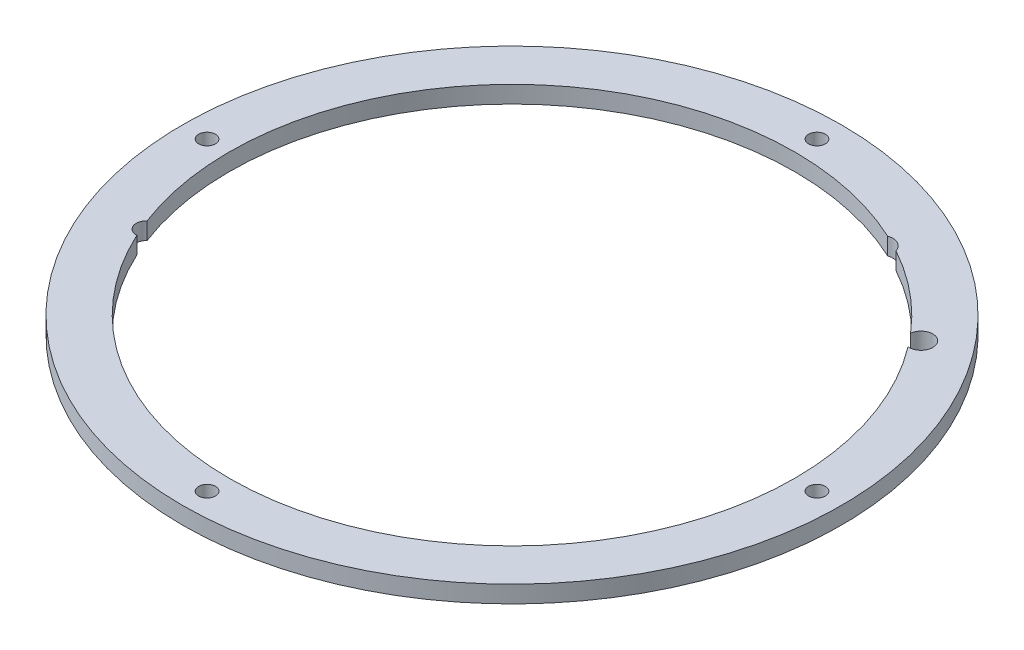
ISO-10303-21;
HEADER;
FILE_DESCRIPTION(('STEP AP214'),'2;1');
FILE_NAME('part.step','',(''),(''),'','','');
FILE_SCHEMA(('AUTOMOTIVE_DESIGN { 1 0 10303 214 1 1 1 1 }'));
ENDSEC;
DATA;
#1=APPLICATION_CONTEXT('core data for automotive mechanical design processes');
#2=APPLICATION_PROTOCOL_DEFINITION('international standard','automotive_design',2000,#1);
#3=PRODUCT_CONTEXT('',#1,'mechanical');
#4=PRODUCT('Part','Part','',(#3));
#5=PRODUCT_RELATED_PRODUCT_CATEGORY('part','',(#4));
#6=PRODUCT_DEFINITION_FORMATION('','',#4);
#7=PRODUCT_DEFINITION_CONTEXT('part definition',#1,'design');
#8=PRODUCT_DEFINITION('design','',#6,#7);
#9=PRODUCT_DEFINITION_SHAPE('','',#8);
#10=(LENGTH_UNIT() NAMED_UNIT(*) SI_UNIT(.MILLI.,.METRE.));
#11=(NAMED_UNIT(*) PLANE_ANGLE_UNIT() SI_UNIT($,.RADIAN.));
#12=(NAMED_UNIT(*) SI_UNIT($,.STERADIAN.) SOLID_ANGLE_UNIT());
#13=UNCERTAINTY_MEASURE_WITH_UNIT(LENGTH_MEASURE(1.E-05),#10,'distance_accuracy_value','');
#14=(GEOMETRIC_REPRESENTATION_CONTEXT(3) GLOBAL_UNCERTAINTY_ASSIGNED_CONTEXT((#13)) GLOBAL_UNIT_ASSIGNED_CONTEXT((#10,
#11,#12)) REPRESENTATION_CONTEXT('',''));
#15=CARTESIAN_POINT('',(0.,0.,0.));
#16=DIRECTION('',(0.,0.,1.));
#17=DIRECTION('',(1.,0.,0.));
#18=AXIS2_PLACEMENT_3D('',#15,#16,#17);
#19=CARTESIAN_POINT('',(0.,5.3,0.));
#20=DIRECTION('',(0.,-1.,0.));
#21=DIRECTION('',(0.,0.,-1.));
#22=AXIS2_PLACEMENT_3D('',#19,#20,#21);
#23=CYLINDRICAL_SURFACE('',#22,87.5);
#24=DIRECTION('',(0.,-1.,0.));
#25=VECTOR('',#24,1.);
#26=CARTESIAN_POINT('',(69.768566442655,2.65,-52.8071693668279));
#27=LINE('',#26,#25);
#28=CARTESIAN_POINT('',(69.7685664426548,0.,-52.807169366828));
#29=VERTEX_POINT('',#28);
#30=CARTESIAN_POINT('',(69.7685664426548,5.3,-52.807169366828));
#31=VERTEX_POINT('',#30);
#32=EDGE_CURVE('E11',#29,#31,#27,.F.);
#33=ORIENTED_EDGE('',*,*,#32,.F.);
#34=CARTESIAN_POINT('',(0.,0.,0.));
#35=DIRECTION('',(0.,1.,0.));
#36=DIRECTION('',(0.,0.,1.));
#37=AXIS2_PLACEMENT_3D('',#34,#35,#36);
#38=CIRCLE('',#37,87.5);
#39=CARTESIAN_POINT('',(-79.4489334925172,0.,36.6622007918454));
#40=VERTEX_POINT('',#39);
#41=EDGE_CURVE('E119',#40,#29,#38,.T.);
#42=ORIENTED_EDGE('',*,*,#41,.F.);
#43=DIRECTION('',(0.,-1.,0.));
#44=VECTOR('',#43,1.);
#45=CARTESIAN_POINT('',(-79.4489334925171,2.65,36.6622007918454));
#46=LINE('',#45,#44);
#47=CARTESIAN_POINT('',(-79.4489334925171,5.3,36.6622007918454));
#48=VERTEX_POINT('',#47);
#49=EDGE_CURVE('E109',#48,#40,#46,.T.);
#50=ORIENTED_EDGE('',*,*,#49,.F.);
#51=CARTESIAN_POINT('',(0.,5.3,0.));
#52=DIRECTION('',(0.,1.,0.));
#53=DIRECTION('',(0.,0.,1.));
#54=AXIS2_PLACEMENT_3D('',#51,#52,#53);
#55=CIRCLE('',#54,87.5);
#56=EDGE_CURVE('E116',#48,#31,#55,.T.);
#57=ORIENTED_EDGE('',*,*,#56,.T.);
#58=EDGE_LOOP('',(#33,#42,#50,#57));
#59=FACE_BOUND('',#58,.T.);
#60=ADVANCED_FACE('F41',(#59),#23,.F.);
#61=DIRECTION('',(0.,-1.,0.));
#62=VECTOR('',#61,1.);
#63=CARTESIAN_POINT('',(-81.7499962013032,2.65,31.1959632178091));
#64=LINE('',#63,#62);
#65=CARTESIAN_POINT('',(-81.7499962013033,0.,31.1959632178092));
#66=VERTEX_POINT('',#65);
#67=CARTESIAN_POINT('',(-81.7499962013033,5.3,31.1959632178092));
#68=VERTEX_POINT('',#67);
#69=EDGE_CURVE('E167',#66,#68,#64,.F.);
#70=ORIENTED_EDGE('',*,*,#69,.F.);
#71=CARTESIAN_POINT('',(36.9899929915719,0.,-79.2968499909263));
#72=VERTEX_POINT('',#71);
#73=EDGE_CURVE('E117',#72,#66,#38,.T.);
#74=ORIENTED_EDGE('',*,*,#73,.F.);
#75=DIRECTION('',(0.,-1.,0.));
#76=VECTOR('',#75,1.);
#77=CARTESIAN_POINT('',(36.9899929915719,2.65,-79.2968499909263));
#78=LINE('',#77,#76);
#79=CARTESIAN_POINT('',(36.9899929915719,5.3,-79.2968499909263));
#80=VERTEX_POINT('',#79);
#81=EDGE_CURVE('E95',#80,#72,#78,.T.);
#82=ORIENTED_EDGE('',*,*,#81,.F.);
#83=EDGE_CURVE('E121',#80,#68,#55,.T.);
#84=ORIENTED_EDGE('',*,*,#83,.T.);
#85=EDGE_LOOP('',(#70,#74,#82,#84));
#86=FACE_BOUND('',#85,.T.);
#87=ADVANCED_FACE('F180',(#86),#23,.F.);
#88=CARTESIAN_POINT('',(0.,5.3,0.));
#89=DIRECTION('',(0.,1.,0.));
#90=DIRECTION('',(0.,0.,1.));
#91=AXIS2_PLACEMENT_3D('',#88,#89,#90);
#92=PLANE('',#91);
#93=CARTESIAN_POINT('',(70.1545724809312,5.3,-56.4367009259157));
#94=DIRECTION('',(0.,-1.,0.));
#95=DIRECTION('',(0.,0.,-1.));
#96=AXIS2_PLACEMENT_3D('',#93,#94,#95);
#97=CIRCLE('',#96,3.64999999999994);
#98=CARTESIAN_POINT('',(66.5266052339602,5.3,-56.837142750536));
#99=VERTEX_POINT('',#98);
#100=EDGE_CURVE('E151',#99,#31,#97,.T.);
#101=ORIENTED_EDGE('',*,*,#100,.T.);
#102=ORIENTED_EDGE('',*,*,#56,.F.);
#103=CARTESIAN_POINT('',(-79.6202235616046,5.3,33.5168614282421));
#104=DIRECTION('',(0.,-1.,0.));
#105=DIRECTION('',(0.,0.,-1.));
#106=AXIS2_PLACEMENT_3D('',#103,#104,#105);
#107=CIRCLE('',#106,3.15);
#108=EDGE_CURVE('E56',#48,#68,#107,.T.);
#109=ORIENTED_EDGE('',*,*,#108,.T.);
#110=ORIENTED_EDGE('',*,*,#83,.F.);
#111=CARTESIAN_POINT('',(38.336469882444,5.3,-75.5302865728557));
#112=DIRECTION('',(0.,-1.,0.));
#113=DIRECTION('',(0.,0.,-1.));
#114=AXIS2_PLACEMENT_3D('',#111,#112,#113);
#115=CIRCLE('',#114,4.00000000000001);
#116=CARTESIAN_POINT('',(42.1715994760188,5.3,-76.6668520133327));
#117=VERTEX_POINT('',#116);
#118=EDGE_CURVE('E64',#80,#117,#115,.T.);
#119=ORIENTED_EDGE('',*,*,#118,.T.);
#120=EDGE_CURVE('E108',#99,#117,#55,.T.);
#121=ORIENTED_EDGE('',*,*,#120,.F.);
#122=EDGE_LOOP('',(#101,#102,#109,#110,#119,#121));
#123=FACE_BOUND('',#122,.T.);
#124=CARTESIAN_POINT('',(0.,5.3,94.385));
#125=DIRECTION('',(0.,1.,0.));
#126=DIRECTION('',(0.,0.,1.));
#127=AXIS2_PLACEMENT_3D('',#124,#125,#126);
#128=CIRCLE('',#127,2.60000000000001);
#129=CARTESIAN_POINT('',(0.,5.3,96.985));
#130=VERTEX_POINT('',#129);
#131=EDGE_CURVE('E139',#130,#130,#128,.T.);
#132=ORIENTED_EDGE('',*,*,#131,.F.);
#133=EDGE_LOOP('',(#132));
#134=FACE_BOUND('',#133,.T.);
#135=CARTESIAN_POINT('',(0.,5.3,-94.385));
#136=DIRECTION('',(0.,1.,0.));
#137=DIRECTION('',(0.,0.,1.));
#138=AXIS2_PLACEMENT_3D('',#135,#136,#137);
#139=CIRCLE('',#138,2.60000000000001);
#140=CARTESIAN_POINT('',(0.,5.3,-91.785));
#141=VERTEX_POINT('',#140);
#142=EDGE_CURVE('E124',#141,#141,#139,.T.);
#143=ORIENTED_EDGE('',*,*,#142,.F.);
#144=EDGE_LOOP('',(#143));
#145=FACE_BOUND('',#144,.T.);
#146=CARTESIAN_POINT('',(0.,5.3,0.));
#147=DIRECTION('',(0.,1.,0.));
#148=DIRECTION('',(0.,0.,1.));
#149=AXIS2_PLACEMENT_3D('',#146,#147,#148);
#150=CIRCLE('',#149,102.);
#151=CARTESIAN_POINT('',(0.,5.3,102.));
#152=VERTEX_POINT('',#151);
#153=EDGE_CURVE('E205',#152,#152,#150,.T.);
#154=ORIENTED_EDGE('',*,*,#153,.T.);
#155=EDGE_LOOP('',(#154));
#156=FACE_BOUND('',#155,.T.);
#157=CARTESIAN_POINT('',(94.385,5.3,0.));
#158=DIRECTION('',(0.,1.,0.));
#159=DIRECTION('',(0.,0.,1.));
#160=AXIS2_PLACEMENT_3D('',#157,#158,#159);
#161=CIRCLE('',#160,2.6);
#162=CARTESIAN_POINT('',(94.385,5.3,2.6));
#163=VERTEX_POINT('',#162);
#164=EDGE_CURVE('E133',#163,#163,#161,.T.);
#165=ORIENTED_EDGE('',*,*,#164,.F.);
#166=EDGE_LOOP('',(#165));
#167=FACE_BOUND('',#166,.T.);
#168=CARTESIAN_POINT('',(-94.385,5.3,0.));
#169=DIRECTION('',(0.,1.,0.));
#170=DIRECTION('',(0.,0.,1.));
#171=AXIS2_PLACEMENT_3D('',#168,#169,#170);
#172=CIRCLE('',#171,2.6);
#173=CARTESIAN_POINT('',(-94.385,5.3,2.6));
#174=VERTEX_POINT('',#173);
#175=EDGE_CURVE('E145',#174,#174,#172,.T.);
#176=ORIENTED_EDGE('',*,*,#175,.F.);
#177=EDGE_LOOP('',(#176));
#178=FACE_BOUND('',#177,.T.);
#179=ADVANCED_FACE('F162',(#123,#134,#145,#156,#167,#178),#92,.T.);
#180=CARTESIAN_POINT('',(0.,0.,0.));
#181=DIRECTION('',(0.,1.,0.));
#182=DIRECTION('',(0.,0.,1.));
#183=AXIS2_PLACEMENT_3D('',#180,#181,#182);
#184=PLANE('',#183);
#185=CARTESIAN_POINT('',(0.,0.,0.));
#186=DIRECTION('',(0.,1.,0.));
#187=DIRECTION('',(0.,0.,1.));
#188=AXIS2_PLACEMENT_3D('',#185,#186,#187);
#189=CIRCLE('',#188,102.);
#190=CARTESIAN_POINT('',(0.,0.,102.));
#191=VERTEX_POINT('',#190);
#192=EDGE_CURVE('E208',#191,#191,#189,.T.);
#193=ORIENTED_EDGE('',*,*,#192,.F.);
#194=EDGE_LOOP('',(#193));
#195=FACE_BOUND('',#194,.T.);
#196=ORIENTED_EDGE('',*,*,#41,.T.);
#197=CARTESIAN_POINT('',(70.1545724809312,0.,-56.4367009259157));
#198=DIRECTION('',(0.,-1.,0.));
#199=DIRECTION('',(0.,0.,-1.));
#200=AXIS2_PLACEMENT_3D('',#197,#198,#199);
#201=CIRCLE('',#200,3.64999999999994);
#202=CARTESIAN_POINT('',(66.5266052339602,0.,-56.837142750536));
#203=VERTEX_POINT('',#202);
#204=EDGE_CURVE('E115',#203,#29,#201,.T.);
#205=ORIENTED_EDGE('',*,*,#204,.F.);
#206=CARTESIAN_POINT('',(42.1715994760188,0.,-76.6668520133327));
#207=VERTEX_POINT('',#206);
#208=EDGE_CURVE('E106',#203,#207,#38,.T.);
#209=ORIENTED_EDGE('',*,*,#208,.T.);
#210=CARTESIAN_POINT('',(38.336469882444,0.,-75.5302865728557));
#211=DIRECTION('',(0.,-1.,0.));
#212=DIRECTION('',(0.,0.,-1.));
#213=AXIS2_PLACEMENT_3D('',#210,#211,#212);
#214=CIRCLE('',#213,4.00000000000001);
#215=EDGE_CURVE('E91',#72,#207,#214,.T.);
#216=ORIENTED_EDGE('',*,*,#215,.F.);
#217=ORIENTED_EDGE('',*,*,#73,.T.);
#218=CARTESIAN_POINT('',(-79.6202235616046,0.,33.5168614282421));
#219=DIRECTION('',(0.,-1.,0.));
#220=DIRECTION('',(0.,0.,-1.));
#221=AXIS2_PLACEMENT_3D('',#218,#219,#220);
#222=CIRCLE('',#221,3.15);
#223=EDGE_CURVE('E156',#40,#66,#222,.T.);
#224=ORIENTED_EDGE('',*,*,#223,.F.);
#225=EDGE_LOOP('',(#196,#205,#209,#216,#217,#224));
#226=FACE_BOUND('',#225,.T.);
#227=CARTESIAN_POINT('',(0.,0.,-94.385));
#228=DIRECTION('',(0.,1.,0.));
#229=DIRECTION('',(0.,0.,1.));
#230=AXIS2_PLACEMENT_3D('',#227,#228,#229);
#231=CIRCLE('',#230,2.60000000000001);
#232=CARTESIAN_POINT('',(0.,0.,-91.785));
#233=VERTEX_POINT('',#232);
#234=EDGE_CURVE('E128',#233,#233,#231,.T.);
#235=ORIENTED_EDGE('',*,*,#234,.T.);
#236=EDGE_LOOP('',(#235));
#237=FACE_BOUND('',#236,.T.);
#238=CARTESIAN_POINT('',(94.385,0.,0.));
#239=DIRECTION('',(0.,1.,0.));
#240=DIRECTION('',(0.,0.,1.));
#241=AXIS2_PLACEMENT_3D('',#238,#239,#240);
#242=CIRCLE('',#241,2.6);
#243=CARTESIAN_POINT('',(94.385,0.,2.6));
#244=VERTEX_POINT('',#243);
#245=EDGE_CURVE('E136',#244,#244,#242,.T.);
#246=ORIENTED_EDGE('',*,*,#245,.T.);
#247=EDGE_LOOP('',(#246));
#248=FACE_BOUND('',#247,.T.);
#249=CARTESIAN_POINT('',(0.,0.,94.385));
#250=DIRECTION('',(0.,1.,0.));
#251=DIRECTION('',(0.,0.,1.));
#252=AXIS2_PLACEMENT_3D('',#249,#250,#251);
#253=CIRCLE('',#252,2.60000000000001);
#254=CARTESIAN_POINT('',(0.,0.,96.985));
#255=VERTEX_POINT('',#254);
#256=EDGE_CURVE('E142',#255,#255,#253,.T.);
#257=ORIENTED_EDGE('',*,*,#256,.T.);
#258=EDGE_LOOP('',(#257));
#259=FACE_BOUND('',#258,.T.);
#260=CARTESIAN_POINT('',(-94.385,0.,0.));
#261=DIRECTION('',(0.,1.,0.));
#262=DIRECTION('',(0.,0.,1.));
#263=AXIS2_PLACEMENT_3D('',#260,#261,#262);
#264=CIRCLE('',#263,2.6);
#265=CARTESIAN_POINT('',(-94.385,0.,2.6));
#266=VERTEX_POINT('',#265);
#267=EDGE_CURVE('E148',#266,#266,#264,.T.);
#268=ORIENTED_EDGE('',*,*,#267,.T.);
#269=EDGE_LOOP('',(#268));
#270=FACE_BOUND('',#269,.T.);
#271=ADVANCED_FACE('F113',(#195,#226,#237,#248,#259,#270),#184,.F.);
#272=CARTESIAN_POINT('',(0.,5.3,0.));
#273=DIRECTION('',(0.,-1.,0.));
#274=DIRECTION('',(0.,0.,-1.));
#275=AXIS2_PLACEMENT_3D('',#272,#273,#274);
#276=CYLINDRICAL_SURFACE('',#275,102.);
#277=ORIENTED_EDGE('',*,*,#153,.F.);
#278=EDGE_LOOP('',(#277));
#279=FACE_BOUND('',#278,.T.);
#280=ORIENTED_EDGE('',*,*,#192,.T.);
#281=EDGE_LOOP('',(#280));
#282=FACE_BOUND('',#281,.T.);
#283=ADVANCED_FACE('F43',(#279,#282),#276,.T.);
#284=DIRECTION('',(0.,-1.,0.));
#285=VECTOR('',#284,1.);
#286=CARTESIAN_POINT('',(66.5266052339603,2.65,-56.8371427505362));
#287=LINE('',#286,#285);
#288=EDGE_CURVE('E49',#99,#203,#287,.T.);
#289=ORIENTED_EDGE('',*,*,#288,.F.);
#290=ORIENTED_EDGE('',*,*,#120,.T.);
#291=DIRECTION('',(0.,-1.,0.));
#292=VECTOR('',#291,1.);
#293=CARTESIAN_POINT('',(42.1715994760188,2.65,-76.6668520133327));
#294=LINE('',#293,#292);
#295=EDGE_CURVE('E94',#207,#117,#294,.F.);
#296=ORIENTED_EDGE('',*,*,#295,.F.);
#297=ORIENTED_EDGE('',*,*,#208,.F.);
#298=EDGE_LOOP('',(#289,#290,#296,#297));
#299=FACE_BOUND('',#298,.T.);
#300=ADVANCED_FACE('F105',(#299),#23,.F.);
#301=CARTESIAN_POINT('',(0.,5.3,-94.385));
#302=DIRECTION('',(0.,-1.,0.));
#303=DIRECTION('',(0.,0.,-1.));
#304=AXIS2_PLACEMENT_3D('',#301,#302,#303);
#305=CYLINDRICAL_SURFACE('',#304,2.60000000000001);
#306=ORIENTED_EDGE('',*,*,#142,.T.);
#307=EDGE_LOOP('',(#306));
#308=FACE_BOUND('',#307,.T.);
#309=ORIENTED_EDGE('',*,*,#234,.F.);
#310=EDGE_LOOP('',(#309));
#311=FACE_BOUND('',#310,.T.);
#312=ADVANCED_FACE('F190',(#308,#311),#305,.F.);
#313=CARTESIAN_POINT('',(94.385,5.3,0.));
#314=DIRECTION('',(0.,-1.,0.));
#315=DIRECTION('',(0.,0.,-1.));
#316=AXIS2_PLACEMENT_3D('',#313,#314,#315);
#317=CYLINDRICAL_SURFACE('',#316,2.6);
#318=ORIENTED_EDGE('',*,*,#164,.T.);
#319=EDGE_LOOP('',(#318));
#320=FACE_BOUND('',#319,.T.);
#321=ORIENTED_EDGE('',*,*,#245,.F.);
#322=EDGE_LOOP('',(#321));
#323=FACE_BOUND('',#322,.T.);
#324=ADVANCED_FACE('F196',(#320,#323),#317,.F.);
#325=CARTESIAN_POINT('',(0.,5.3,94.385));
#326=DIRECTION('',(0.,-1.,0.));
#327=DIRECTION('',(0.,0.,-1.));
#328=AXIS2_PLACEMENT_3D('',#325,#326,#327);
#329=CYLINDRICAL_SURFACE('',#328,2.60000000000001);
#330=ORIENTED_EDGE('',*,*,#131,.T.);
#331=EDGE_LOOP('',(#330));
#332=FACE_BOUND('',#331,.T.);
#333=ORIENTED_EDGE('',*,*,#256,.F.);
#334=EDGE_LOOP('',(#333));
#335=FACE_BOUND('',#334,.T.);
#336=ADVANCED_FACE('F222',(#332,#335),#329,.F.);
#337=CARTESIAN_POINT('',(-94.385,5.3,0.));
#338=DIRECTION('',(0.,-1.,0.));
#339=DIRECTION('',(0.,0.,-1.));
#340=AXIS2_PLACEMENT_3D('',#337,#338,#339);
#341=CYLINDRICAL_SURFACE('',#340,2.6);
#342=ORIENTED_EDGE('',*,*,#175,.T.);
#343=EDGE_LOOP('',(#342));
#344=FACE_BOUND('',#343,.T.);
#345=ORIENTED_EDGE('',*,*,#267,.F.);
#346=EDGE_LOOP('',(#345));
#347=FACE_BOUND('',#346,.T.);
#348=ADVANCED_FACE('F220',(#344,#347),#341,.F.);
#349=CARTESIAN_POINT('',(38.336469882444,5.3,-75.5302865728557));
#350=DIRECTION('',(0.,-1.,0.));
#351=DIRECTION('',(0.,0.,-1.));
#352=AXIS2_PLACEMENT_3D('',#349,#350,#351);
#353=CYLINDRICAL_SURFACE('',#352,4.00000000000001);
#354=ORIENTED_EDGE('',*,*,#295,.T.);
#355=ORIENTED_EDGE('',*,*,#118,.F.);
#356=ORIENTED_EDGE('',*,*,#81,.T.);
#357=ORIENTED_EDGE('',*,*,#215,.T.);
#358=EDGE_LOOP('',(#354,#355,#356,#357));
#359=FACE_BOUND('',#358,.T.);
#360=ADVANCED_FACE('F93',(#359),#353,.F.);
#361=CARTESIAN_POINT('',(-79.6202235616046,5.3,33.5168614282421));
#362=DIRECTION('',(0.,-1.,0.));
#363=DIRECTION('',(0.,0.,-1.));
#364=AXIS2_PLACEMENT_3D('',#361,#362,#363);
#365=CYLINDRICAL_SURFACE('',#364,3.15);
#366=ORIENTED_EDGE('',*,*,#69,.T.);
#367=ORIENTED_EDGE('',*,*,#108,.F.);
#368=ORIENTED_EDGE('',*,*,#49,.T.);
#369=ORIENTED_EDGE('',*,*,#223,.T.);
#370=EDGE_LOOP('',(#366,#367,#368,#369));
#371=FACE_BOUND('',#370,.T.);
#372=ADVANCED_FACE('F173',(#371),#365,.F.);
#373=CARTESIAN_POINT('',(70.1545724809312,5.3,-56.4367009259157));
#374=DIRECTION('',(0.,-1.,0.));
#375=DIRECTION('',(0.,0.,-1.));
#376=AXIS2_PLACEMENT_3D('',#373,#374,#375);
#377=CYLINDRICAL_SURFACE('',#376,3.64999999999994);
#378=ORIENTED_EDGE('',*,*,#32,.T.);
#379=ORIENTED_EDGE('',*,*,#100,.F.);
#380=ORIENTED_EDGE('',*,*,#288,.T.);
#381=ORIENTED_EDGE('',*,*,#204,.T.);
#382=EDGE_LOOP('',(#378,#379,#380,#381));
#383=FACE_BOUND('',#382,.T.);
#384=ADVANCED_FACE('F171',(#383),#377,.F.);
#385=CLOSED_SHELL('',(#60,#87,#179,#271,#283,#300,#312,#324,#336,#348,#360,#372,#384));
#386=MANIFOLD_SOLID_BREP('B2',#385);
#387=ADVANCED_BREP_SHAPE_REPRESENTATION('',(#18,#386),#14);
#388=SHAPE_DEFINITION_REPRESENTATION(#9,#387);
ENDSEC;
END-ISO-10303-21;
